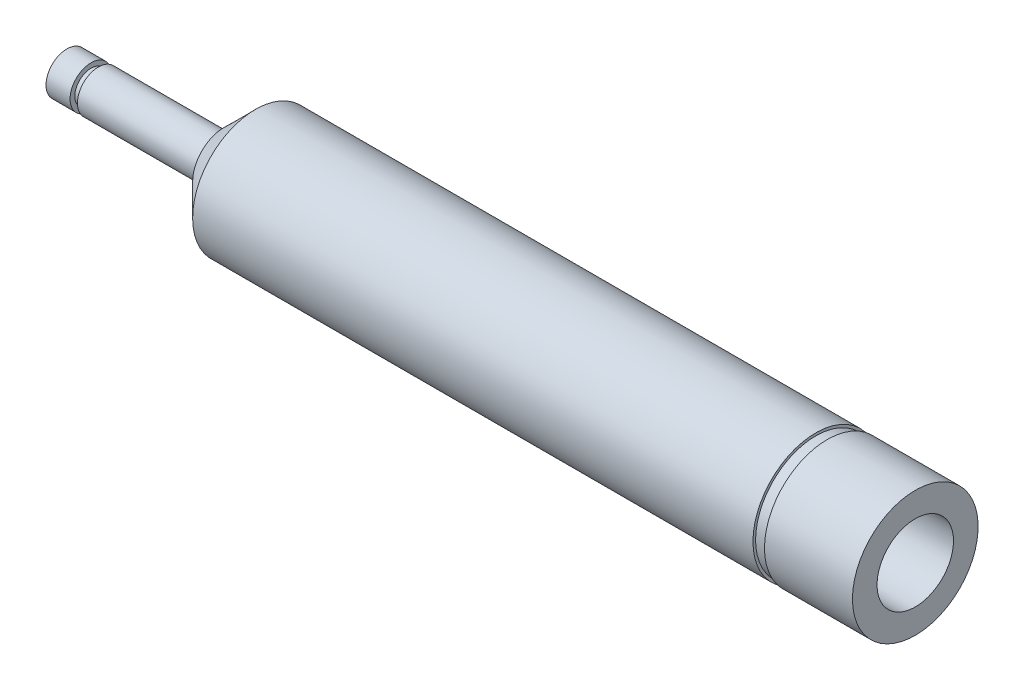
ISO-10303-21;
HEADER;
FILE_DESCRIPTION(('STEP AP214'),'2;1');
FILE_NAME('part.step','',(''),(''),'','','');
FILE_SCHEMA(('AUTOMOTIVE_DESIGN { 1 0 10303 214 1 1 1 1 }'));
ENDSEC;
DATA;
#1=APPLICATION_CONTEXT('core data for automotive mechanical design processes');
#2=APPLICATION_PROTOCOL_DEFINITION('international standard','automotive_design',2000,#1);
#3=PRODUCT_CONTEXT('',#1,'mechanical');
#4=PRODUCT('Part','Part','',(#3));
#5=PRODUCT_RELATED_PRODUCT_CATEGORY('part','',(#4));
#6=PRODUCT_DEFINITION_FORMATION('','',#4);
#7=PRODUCT_DEFINITION_CONTEXT('part definition',#1,'design');
#8=PRODUCT_DEFINITION('design','',#6,#7);
#9=PRODUCT_DEFINITION_SHAPE('','',#8);
#10=(LENGTH_UNIT() NAMED_UNIT(*) SI_UNIT(.MILLI.,.METRE.));
#11=(NAMED_UNIT(*) PLANE_ANGLE_UNIT() SI_UNIT($,.RADIAN.));
#12=(NAMED_UNIT(*) SI_UNIT($,.STERADIAN.) SOLID_ANGLE_UNIT());
#13=UNCERTAINTY_MEASURE_WITH_UNIT(LENGTH_MEASURE(1.E-05),#10,'distance_accuracy_value','');
#14=(GEOMETRIC_REPRESENTATION_CONTEXT(3) GLOBAL_UNCERTAINTY_ASSIGNED_CONTEXT((#13)) GLOBAL_UNIT_ASSIGNED_CONTEXT((#10,
#11,#12)) REPRESENTATION_CONTEXT('',''));
#15=CARTESIAN_POINT('',(0.,0.,0.));
#16=DIRECTION('',(0.,0.,1.));
#17=DIRECTION('',(1.,0.,0.));
#18=AXIS2_PLACEMENT_3D('',#15,#16,#17);
#19=CARTESIAN_POINT('',(0.,0.,0.));
#20=DIRECTION('',(-1.,0.,0.));
#21=DIRECTION('',(0.,0.,1.));
#22=AXIS2_PLACEMENT_3D('',#19,#20,#21);
#23=PLANE('',#22);
#24=CARTESIAN_POINT('',(0.,0.,0.));
#25=DIRECTION('',(-1.,0.,0.));
#26=DIRECTION('',(0.,0.,1.));
#27=AXIS2_PLACEMENT_3D('',#24,#25,#26);
#28=CIRCLE('',#27,6.);
#29=CARTESIAN_POINT('',(0.,0.,6.));
#30=VERTEX_POINT('',#29);
#31=EDGE_CURVE('E150',#30,#30,#28,.T.);
#32=ORIENTED_EDGE('',*,*,#31,.F.);
#33=EDGE_LOOP('',(#32));
#34=FACE_BOUND('',#33,.T.);
#35=CARTESIAN_POINT('',(0.,0.,0.));
#36=DIRECTION('',(1.,0.,0.));
#37=DIRECTION('',(0.,0.,-1.));
#38=AXIS2_PLACEMENT_3D('',#35,#36,#37);
#39=CIRCLE('',#38,3.65);
#40=CARTESIAN_POINT('',(0.,0.,-3.65));
#41=VERTEX_POINT('',#40);
#42=EDGE_CURVE('E161',#41,#41,#39,.T.);
#43=ORIENTED_EDGE('',*,*,#42,.F.);
#44=EDGE_LOOP('',(#43));
#45=FACE_BOUND('',#44,.T.);
#46=ADVANCED_FACE('F35',(#34,#45),#23,.F.);
#47=CARTESIAN_POINT('',(-81.,2.,0.));
#48=DIRECTION('',(1.,0.,0.));
#49=DIRECTION('',(0.,0.,-1.));
#50=AXIS2_PLACEMENT_3D('',#47,#48,#49);
#51=PLANE('',#50);
#52=CARTESIAN_POINT('',(-81.,0.,0.));
#53=DIRECTION('',(-1.,0.,0.));
#54=DIRECTION('',(0.,0.,1.));
#55=AXIS2_PLACEMENT_3D('',#52,#53,#54);
#56=CIRCLE('',#55,2.);
#57=CARTESIAN_POINT('',(-81.,0.,2.));
#58=VERTEX_POINT('',#57);
#59=EDGE_CURVE('E11',#58,#58,#56,.T.);
#60=ORIENTED_EDGE('',*,*,#59,.T.);
#61=EDGE_LOOP('',(#60));
#62=FACE_BOUND('',#61,.T.);
#63=ADVANCED_FACE('F37',(#62),#51,.F.);
#64=CARTESIAN_POINT('',(-95.7957895867425,0.,0.));
#65=DIRECTION('',(-1.,0.,0.));
#66=DIRECTION('',(0.,0.,1.));
#67=AXIS2_PLACEMENT_3D('',#64,#65,#66);
#68=CYLINDRICAL_SURFACE('',#67,2.);
#69=ORIENTED_EDGE('',*,*,#59,.F.);
#70=EDGE_LOOP('',(#69));
#71=FACE_BOUND('',#70,.T.);
#72=CARTESIAN_POINT('',(-78.7,0.,0.));
#73=DIRECTION('',(-1.,0.,0.));
#74=DIRECTION('',(0.,0.,1.));
#75=AXIS2_PLACEMENT_3D('',#72,#73,#74);
#76=CIRCLE('',#75,2.);
#77=CARTESIAN_POINT('',(-78.7,0.,2.));
#78=VERTEX_POINT('',#77);
#79=EDGE_CURVE('E42',#78,#78,#76,.T.);
#80=ORIENTED_EDGE('',*,*,#79,.T.);
#81=EDGE_LOOP('',(#80));
#82=FACE_BOUND('',#81,.T.);
#83=ADVANCED_FACE('F68',(#71,#82),#68,.T.);
#84=CARTESIAN_POINT('',(-78.7,1.55,0.));
#85=DIRECTION('',(-1.,0.,0.));
#86=DIRECTION('',(0.,0.,1.));
#87=AXIS2_PLACEMENT_3D('',#84,#85,#86);
#88=PLANE('',#87);
#89=ORIENTED_EDGE('',*,*,#79,.F.);
#90=EDGE_LOOP('',(#89));
#91=FACE_BOUND('',#90,.T.);
#92=CARTESIAN_POINT('',(-78.7,0.,0.));
#93=DIRECTION('',(-1.,0.,0.));
#94=DIRECTION('',(0.,0.,1.));
#95=AXIS2_PLACEMENT_3D('',#92,#93,#94);
#96=CIRCLE('',#95,1.55);
#97=CARTESIAN_POINT('',(-78.7,0.,1.55));
#98=VERTEX_POINT('',#97);
#99=EDGE_CURVE('E119',#98,#98,#96,.T.);
#100=ORIENTED_EDGE('',*,*,#99,.T.);
#101=EDGE_LOOP('',(#100));
#102=FACE_BOUND('',#101,.T.);
#103=ADVANCED_FACE('F107',(#91,#102),#88,.F.);
#104=CARTESIAN_POINT('',(-95.7957895867425,0.,0.));
#105=DIRECTION('',(-1.,0.,0.));
#106=DIRECTION('',(0.,0.,1.));
#107=AXIS2_PLACEMENT_3D('',#104,#105,#106);
#108=CYLINDRICAL_SURFACE('',#107,1.55);
#109=ORIENTED_EDGE('',*,*,#99,.F.);
#110=EDGE_LOOP('',(#109));
#111=FACE_BOUND('',#110,.T.);
#112=CARTESIAN_POINT('',(-78.,0.,0.));
#113=DIRECTION('',(-1.,0.,0.));
#114=DIRECTION('',(0.,0.,1.));
#115=AXIS2_PLACEMENT_3D('',#112,#113,#114);
#116=CIRCLE('',#115,1.55);
#117=CARTESIAN_POINT('',(-78.,0.,1.55));
#118=VERTEX_POINT('',#117);
#119=EDGE_CURVE('E121',#118,#118,#116,.T.);
#120=ORIENTED_EDGE('',*,*,#119,.T.);
#121=EDGE_LOOP('',(#120));
#122=FACE_BOUND('',#121,.T.);
#123=ADVANCED_FACE('F103',(#111,#122),#108,.T.);
#124=CARTESIAN_POINT('',(-78.,2.,0.));
#125=DIRECTION('',(1.,0.,0.));
#126=DIRECTION('',(0.,0.,-1.));
#127=AXIS2_PLACEMENT_3D('',#124,#125,#126);
#128=PLANE('',#127);
#129=ORIENTED_EDGE('',*,*,#119,.F.);
#130=EDGE_LOOP('',(#129));
#131=FACE_BOUND('',#130,.T.);
#132=CARTESIAN_POINT('',(-78.,0.,0.));
#133=DIRECTION('',(-1.,0.,0.));
#134=DIRECTION('',(0.,0.,1.));
#135=AXIS2_PLACEMENT_3D('',#132,#133,#134);
#136=CIRCLE('',#135,2.);
#137=CARTESIAN_POINT('',(-78.,0.,2.));
#138=VERTEX_POINT('',#137);
#139=EDGE_CURVE('E126',#138,#138,#136,.T.);
#140=ORIENTED_EDGE('',*,*,#139,.T.);
#141=EDGE_LOOP('',(#140));
#142=FACE_BOUND('',#141,.T.);
#143=ADVANCED_FACE('F99',(#131,#142),#128,.F.);
#144=CARTESIAN_POINT('',(-95.7957895867425,0.,0.));
#145=DIRECTION('',(-1.,0.,0.));
#146=DIRECTION('',(0.,0.,1.));
#147=AXIS2_PLACEMENT_3D('',#144,#145,#146);
#148=CYLINDRICAL_SURFACE('',#147,2.);
#149=ORIENTED_EDGE('',*,*,#139,.F.);
#150=EDGE_LOOP('',(#149));
#151=FACE_BOUND('',#150,.T.);
#152=CARTESIAN_POINT('',(-66.,0.,0.));
#153=DIRECTION('',(-1.,0.,0.));
#154=DIRECTION('',(0.,0.,1.));
#155=AXIS2_PLACEMENT_3D('',#152,#153,#154);
#156=CIRCLE('',#155,2.);
#157=CARTESIAN_POINT('',(-66.,0.,2.));
#158=VERTEX_POINT('',#157);
#159=EDGE_CURVE('E129',#158,#158,#156,.T.);
#160=ORIENTED_EDGE('',*,*,#159,.T.);
#161=EDGE_LOOP('',(#160));
#162=FACE_BOUND('',#161,.T.);
#163=ADVANCED_FACE('F95',(#151,#162),#148,.T.);
#164=CARTESIAN_POINT('',(-66.,3.,0.));
#165=DIRECTION('',(1.,0.,0.));
#166=DIRECTION('',(0.,0.,-1.));
#167=AXIS2_PLACEMENT_3D('',#164,#165,#166);
#168=PLANE('',#167);
#169=ORIENTED_EDGE('',*,*,#159,.F.);
#170=EDGE_LOOP('',(#169));
#171=FACE_BOUND('',#170,.T.);
#172=CARTESIAN_POINT('',(-66.,0.,0.));
#173=DIRECTION('',(-1.,0.,0.));
#174=DIRECTION('',(0.,0.,1.));
#175=AXIS2_PLACEMENT_3D('',#172,#173,#174);
#176=CIRCLE('',#175,3.);
#177=CARTESIAN_POINT('',(-66.,0.,3.));
#178=VERTEX_POINT('',#177);
#179=EDGE_CURVE('E132',#178,#178,#176,.T.);
#180=ORIENTED_EDGE('',*,*,#179,.T.);
#181=EDGE_LOOP('',(#180));
#182=FACE_BOUND('',#181,.T.);
#183=ADVANCED_FACE('F91',(#171,#182),#168,.F.);
#184=CARTESIAN_POINT('',(-63.,0.,0.));
#185=DIRECTION('',(1.,0.,0.));
#186=DIRECTION('',(0.,0.,-1.));
#187=AXIS2_PLACEMENT_3D('',#184,#185,#186);
#188=CONICAL_SURFACE('',#187,5.99999999999999,0.785398163397449);
#189=ORIENTED_EDGE('',*,*,#179,.F.);
#190=EDGE_LOOP('',(#189));
#191=FACE_BOUND('',#190,.T.);
#192=CARTESIAN_POINT('',(-63.,0.,0.));
#193=DIRECTION('',(-1.,0.,0.));
#194=DIRECTION('',(0.,0.,1.));
#195=AXIS2_PLACEMENT_3D('',#192,#193,#194);
#196=CIRCLE('',#195,5.99999999999999);
#197=CARTESIAN_POINT('',(-63.,0.,5.99999999999999));
#198=VERTEX_POINT('',#197);
#199=EDGE_CURVE('E135',#198,#198,#196,.T.);
#200=ORIENTED_EDGE('',*,*,#199,.T.);
#201=EDGE_LOOP('',(#200));
#202=FACE_BOUND('',#201,.T.);
#203=ADVANCED_FACE('F87',(#191,#202),#188,.T.);
#204=CARTESIAN_POINT('',(-95.7957895867425,0.,0.));
#205=DIRECTION('',(-1.,0.,0.));
#206=DIRECTION('',(0.,0.,1.));
#207=AXIS2_PLACEMENT_3D('',#204,#205,#206);
#208=CYLINDRICAL_SURFACE('',#207,6.);
#209=ORIENTED_EDGE('',*,*,#199,.F.);
#210=EDGE_LOOP('',(#209));
#211=FACE_BOUND('',#210,.T.);
#212=CARTESIAN_POINT('',(-9.49999999999999,0.,0.));
#213=DIRECTION('',(-1.,0.,0.));
#214=DIRECTION('',(0.,0.,1.));
#215=AXIS2_PLACEMENT_3D('',#212,#213,#214);
#216=CIRCLE('',#215,6.);
#217=CARTESIAN_POINT('',(-9.49999999999999,0.,6.));
#218=VERTEX_POINT('',#217);
#219=EDGE_CURVE('E138',#218,#218,#216,.T.);
#220=ORIENTED_EDGE('',*,*,#219,.T.);
#221=EDGE_LOOP('',(#220));
#222=FACE_BOUND('',#221,.T.);
#223=ADVANCED_FACE('F83',(#211,#222),#208,.T.);
#224=CARTESIAN_POINT('',(-9.5,5.75,0.));
#225=DIRECTION('',(-1.,0.,0.));
#226=DIRECTION('',(0.,0.,1.));
#227=AXIS2_PLACEMENT_3D('',#224,#225,#226);
#228=PLANE('',#227);
#229=ORIENTED_EDGE('',*,*,#219,.F.);
#230=EDGE_LOOP('',(#229));
#231=FACE_BOUND('',#230,.T.);
#232=CARTESIAN_POINT('',(-9.49999999999999,0.,0.));
#233=DIRECTION('',(-1.,0.,0.));
#234=DIRECTION('',(0.,0.,1.));
#235=AXIS2_PLACEMENT_3D('',#232,#233,#234);
#236=CIRCLE('',#235,5.75);
#237=CARTESIAN_POINT('',(-9.49999999999999,0.,5.75));
#238=VERTEX_POINT('',#237);
#239=EDGE_CURVE('E141',#238,#238,#236,.T.);
#240=ORIENTED_EDGE('',*,*,#239,.T.);
#241=EDGE_LOOP('',(#240));
#242=FACE_BOUND('',#241,.T.);
#243=ADVANCED_FACE('F79',(#231,#242),#228,.F.);
#244=CARTESIAN_POINT('',(-95.7957895867425,0.,0.));
#245=DIRECTION('',(-1.,0.,0.));
#246=DIRECTION('',(0.,0.,1.));
#247=AXIS2_PLACEMENT_3D('',#244,#245,#246);
#248=CYLINDRICAL_SURFACE('',#247,5.75);
#249=ORIENTED_EDGE('',*,*,#239,.F.);
#250=EDGE_LOOP('',(#249));
#251=FACE_BOUND('',#250,.T.);
#252=CARTESIAN_POINT('',(-8.4,0.,0.));
#253=DIRECTION('',(-1.,0.,0.));
#254=DIRECTION('',(0.,0.,1.));
#255=AXIS2_PLACEMENT_3D('',#252,#253,#254);
#256=CIRCLE('',#255,5.75);
#257=CARTESIAN_POINT('',(-8.4,0.,5.75));
#258=VERTEX_POINT('',#257);
#259=EDGE_CURVE('E144',#258,#258,#256,.T.);
#260=ORIENTED_EDGE('',*,*,#259,.T.);
#261=EDGE_LOOP('',(#260));
#262=FACE_BOUND('',#261,.T.);
#263=ADVANCED_FACE('F75',(#251,#262),#248,.T.);
#264=CARTESIAN_POINT('',(-8.4,6.,0.));
#265=DIRECTION('',(1.,0.,0.));
#266=DIRECTION('',(0.,0.,-1.));
#267=AXIS2_PLACEMENT_3D('',#264,#265,#266);
#268=PLANE('',#267);
#269=ORIENTED_EDGE('',*,*,#259,.F.);
#270=EDGE_LOOP('',(#269));
#271=FACE_BOUND('',#270,.T.);
#272=CARTESIAN_POINT('',(-8.4,0.,0.));
#273=DIRECTION('',(-1.,0.,0.));
#274=DIRECTION('',(0.,0.,1.));
#275=AXIS2_PLACEMENT_3D('',#272,#273,#274);
#276=CIRCLE('',#275,6.);
#277=CARTESIAN_POINT('',(-8.4,0.,6.));
#278=VERTEX_POINT('',#277);
#279=EDGE_CURVE('E147',#278,#278,#276,.T.);
#280=ORIENTED_EDGE('',*,*,#279,.T.);
#281=EDGE_LOOP('',(#280));
#282=FACE_BOUND('',#281,.T.);
#283=ADVANCED_FACE('F58',(#271,#282),#268,.F.);
#284=CARTESIAN_POINT('',(-95.7957895867425,0.,0.));
#285=DIRECTION('',(-1.,0.,0.));
#286=DIRECTION('',(0.,0.,1.));
#287=AXIS2_PLACEMENT_3D('',#284,#285,#286);
#288=CYLINDRICAL_SURFACE('',#287,6.);
#289=ORIENTED_EDGE('',*,*,#279,.F.);
#290=EDGE_LOOP('',(#289));
#291=FACE_BOUND('',#290,.T.);
#292=ORIENTED_EDGE('',*,*,#31,.T.);
#293=EDGE_LOOP('',(#292));
#294=FACE_BOUND('',#293,.T.);
#295=ADVANCED_FACE('F48',(#291,#294),#288,.T.);
#296=CARTESIAN_POINT('',(-36.5877132402715,0.,0.));
#297=DIRECTION('',(1.,0.,0.));
#298=DIRECTION('',(0.,0.,-1.));
#299=AXIS2_PLACEMENT_3D('',#296,#297,#298);
#300=CONICAL_SURFACE('',#299,0.,1.0471975511966);
#301=CARTESIAN_POINT('',(-35.,0.,0.));
#302=DIRECTION('',(1.,0.,0.));
#303=DIRECTION('',(0.,0.,-1.));
#304=AXIS2_PLACEMENT_3D('',#301,#302,#303);
#305=CIRCLE('',#304,2.75);
#306=CARTESIAN_POINT('',(-35.,0.,-2.75));
#307=VERTEX_POINT('',#306);
#308=EDGE_CURVE('E153',#307,#307,#305,.T.);
#309=ORIENTED_EDGE('',*,*,#308,.T.);
#310=EDGE_LOOP('',(#309));
#311=FACE_BOUND('',#310,.T.);
#312=CARTESIAN_POINT('',(-36.5877132402715,0.,0.));
#313=VERTEX_POINT('',#312);
#314=VERTEX_LOOP('',#313);
#315=FACE_BOUND('',#314,.T.);
#316=ADVANCED_FACE('F45',(#311,#315),#300,.F.);
#317=CARTESIAN_POINT('',(0.,0.,0.));
#318=DIRECTION('',(1.,0.,0.));
#319=DIRECTION('',(0.,0.,-1.));
#320=AXIS2_PLACEMENT_3D('',#317,#318,#319);
#321=CYLINDRICAL_SURFACE('',#320,2.75);
#322=CARTESIAN_POINT('',(-13.,0.,0.));
#323=DIRECTION('',(1.,0.,0.));
#324=DIRECTION('',(0.,0.,-1.));
#325=AXIS2_PLACEMENT_3D('',#322,#323,#324);
#326=CIRCLE('',#325,2.75);
#327=CARTESIAN_POINT('',(-13.,0.,-2.75));
#328=VERTEX_POINT('',#327);
#329=EDGE_CURVE('E155',#328,#328,#326,.T.);
#330=ORIENTED_EDGE('',*,*,#329,.T.);
#331=EDGE_LOOP('',(#330));
#332=FACE_BOUND('',#331,.T.);
#333=ORIENTED_EDGE('',*,*,#308,.F.);
#334=EDGE_LOOP('',(#333));
#335=FACE_BOUND('',#334,.T.);
#336=ADVANCED_FACE('F47',(#332,#335),#321,.F.);
#337=CARTESIAN_POINT('',(-13.,2.75,0.));
#338=DIRECTION('',(1.,0.,0.));
#339=DIRECTION('',(0.,0.,-1.));
#340=AXIS2_PLACEMENT_3D('',#337,#338,#339);
#341=PLANE('',#340);
#342=CARTESIAN_POINT('',(-13.,0.,0.));
#343=DIRECTION('',(1.,0.,0.));
#344=DIRECTION('',(0.,0.,-1.));
#345=AXIS2_PLACEMENT_3D('',#342,#343,#344);
#346=CIRCLE('',#345,3.65);
#347=CARTESIAN_POINT('',(-13.,0.,-3.65));
#348=VERTEX_POINT('',#347);
#349=EDGE_CURVE('E158',#348,#348,#346,.T.);
#350=ORIENTED_EDGE('',*,*,#349,.T.);
#351=EDGE_LOOP('',(#350));
#352=FACE_BOUND('',#351,.T.);
#353=ORIENTED_EDGE('',*,*,#329,.F.);
#354=EDGE_LOOP('',(#353));
#355=FACE_BOUND('',#354,.T.);
#356=ADVANCED_FACE('F55',(#352,#355),#341,.T.);
#357=CARTESIAN_POINT('',(0.,0.,0.));
#358=DIRECTION('',(1.,0.,0.));
#359=DIRECTION('',(0.,0.,-1.));
#360=AXIS2_PLACEMENT_3D('',#357,#358,#359);
#361=CYLINDRICAL_SURFACE('',#360,3.65);
#362=ORIENTED_EDGE('',*,*,#42,.T.);
#363=EDGE_LOOP('',(#362));
#364=FACE_BOUND('',#363,.T.);
#365=ORIENTED_EDGE('',*,*,#349,.F.);
#366=EDGE_LOOP('',(#365));
#367=FACE_BOUND('',#366,.T.);
#368=ADVANCED_FACE('F165',(#364,#367),#361,.F.);
#369=CLOSED_SHELL('',(#46,#63,#83,#103,#123,#143,#163,#183,#203,#223,#243,#263,#283,#295,#316,
#336,#356,#368));
#370=MANIFOLD_SOLID_BREP('B2',#369);
#371=ADVANCED_BREP_SHAPE_REPRESENTATION('',(#18,#370),#14);
#372=SHAPE_DEFINITION_REPRESENTATION(#9,#371);
ENDSEC;
END-ISO-10303-21;
